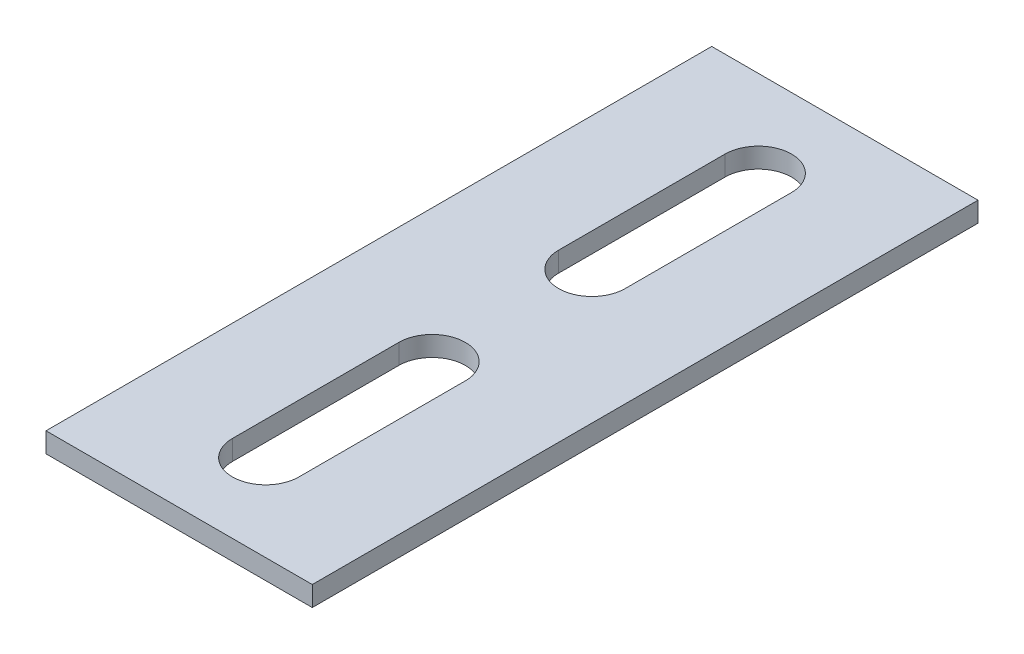
ISO-10303-21;
HEADER;
FILE_DESCRIPTION(('STEP AP214'),'2;1');
FILE_NAME('part.step','',(''),(''),'','','');
FILE_SCHEMA(('AUTOMOTIVE_DESIGN { 1 0 10303 214 1 1 1 1 }'));
ENDSEC;
DATA;
#1=APPLICATION_CONTEXT('core data for automotive mechanical design processes');
#2=APPLICATION_PROTOCOL_DEFINITION('international standard','automotive_design',2000,#1);
#3=PRODUCT_CONTEXT('',#1,'mechanical');
#4=PRODUCT('Part','Part','',(#3));
#5=PRODUCT_RELATED_PRODUCT_CATEGORY('part','',(#4));
#6=PRODUCT_DEFINITION_FORMATION('','',#4);
#7=PRODUCT_DEFINITION_CONTEXT('part definition',#1,'design');
#8=PRODUCT_DEFINITION('design','',#6,#7);
#9=PRODUCT_DEFINITION_SHAPE('','',#8);
#10=(LENGTH_UNIT() NAMED_UNIT(*) SI_UNIT(.MILLI.,.METRE.));
#11=(NAMED_UNIT(*) PLANE_ANGLE_UNIT() SI_UNIT($,.RADIAN.));
#12=(NAMED_UNIT(*) SI_UNIT($,.STERADIAN.) SOLID_ANGLE_UNIT());
#13=UNCERTAINTY_MEASURE_WITH_UNIT(LENGTH_MEASURE(1.E-05),#10,'distance_accuracy_value','');
#14=(GEOMETRIC_REPRESENTATION_CONTEXT(3) GLOBAL_UNCERTAINTY_ASSIGNED_CONTEXT((#13)) GLOBAL_UNIT_ASSIGNED_CONTEXT((#10,
#11,#12)) REPRESENTATION_CONTEXT('',''));
#15=CARTESIAN_POINT('',(0.,0.,0.));
#16=DIRECTION('',(0.,0.,1.));
#17=DIRECTION('',(1.,0.,0.));
#18=AXIS2_PLACEMENT_3D('',#15,#16,#17);
#19=CARTESIAN_POINT('',(0.,1.5,0.));
#20=DIRECTION('',(0.,-1.,0.));
#21=DIRECTION('',(0.,0.,-1.));
#22=AXIS2_PLACEMENT_3D('',#19,#20,#21);
#23=PLANE('',#22);
#24=CARTESIAN_POINT('',(0.,1.5,-12.));
#25=DIRECTION('',(0.,1.,0.));
#26=DIRECTION('',(0.,0.,1.));
#27=AXIS2_PLACEMENT_3D('',#24,#25,#26);
#28=CIRCLE('',#27,5.);
#29=CARTESIAN_POINT('',(-4.99999999999999,1.5,-12.));
#30=VERTEX_POINT('',#29);
#31=CARTESIAN_POINT('',(5.00000000000001,1.5,-12.));
#32=VERTEX_POINT('',#31);
#33=EDGE_CURVE('E162',#30,#32,#28,.T.);
#34=ORIENTED_EDGE('',*,*,#33,.F.);
#35=DIRECTION('',(0.,0.,1.));
#36=VECTOR('',#35,1.);
#37=CARTESIAN_POINT('',(-4.99999999999999,1.5,-12.));
#38=LINE('',#37,#36);
#39=CARTESIAN_POINT('',(-5.,1.5,-37.));
#40=VERTEX_POINT('',#39);
#41=EDGE_CURVE('E170',#40,#30,#38,.T.);
#42=ORIENTED_EDGE('',*,*,#41,.F.);
#43=CARTESIAN_POINT('',(0.,1.5,-37.));
#44=DIRECTION('',(0.,1.,0.));
#45=DIRECTION('',(0.,0.,1.));
#46=AXIS2_PLACEMENT_3D('',#43,#44,#45);
#47=CIRCLE('',#46,5.);
#48=CARTESIAN_POINT('',(5.,1.5,-37.));
#49=VERTEX_POINT('',#48);
#50=EDGE_CURVE('E167',#49,#40,#47,.T.);
#51=ORIENTED_EDGE('',*,*,#50,.F.);
#52=DIRECTION('',(0.,0.,-1.));
#53=VECTOR('',#52,1.);
#54=CARTESIAN_POINT('',(5.00000000000001,1.5,-12.));
#55=LINE('',#54,#53);
#56=EDGE_CURVE('E164',#32,#49,#55,.T.);
#57=ORIENTED_EDGE('',*,*,#56,.F.);
#58=EDGE_LOOP('',(#34,#42,#51,#57));
#59=FACE_BOUND('',#58,.T.);
#60=DIRECTION('',(0.,0.,-1.));
#61=VECTOR('',#60,1.);
#62=CARTESIAN_POINT('',(20.,1.5,50.));
#63=LINE('',#62,#61);
#64=CARTESIAN_POINT('',(20.,1.5,50.));
#65=VERTEX_POINT('',#64);
#66=CARTESIAN_POINT('',(20.,1.5,-50.));
#67=VERTEX_POINT('',#66);
#68=EDGE_CURVE('E193',#65,#67,#63,.T.);
#69=ORIENTED_EDGE('',*,*,#68,.T.);
#70=DIRECTION('',(-1.,0.,0.));
#71=VECTOR('',#70,1.);
#72=CARTESIAN_POINT('',(-20.,1.5,-50.));
#73=LINE('',#72,#71);
#74=CARTESIAN_POINT('',(-20.,1.5,-50.));
#75=VERTEX_POINT('',#74);
#76=EDGE_CURVE('E196',#67,#75,#73,.T.);
#77=ORIENTED_EDGE('',*,*,#76,.T.);
#78=DIRECTION('',(0.,0.,1.));
#79=VECTOR('',#78,1.);
#80=CARTESIAN_POINT('',(-20.,1.5,50.));
#81=LINE('',#80,#79);
#82=CARTESIAN_POINT('',(-20.,1.5,50.));
#83=VERTEX_POINT('',#82);
#84=EDGE_CURVE('E199',#75,#83,#81,.T.);
#85=ORIENTED_EDGE('',*,*,#84,.T.);
#86=DIRECTION('',(1.,0.,0.));
#87=VECTOR('',#86,1.);
#88=CARTESIAN_POINT('',(-20.,1.5,50.));
#89=LINE('',#88,#87);
#90=EDGE_CURVE('E201',#83,#65,#89,.T.);
#91=ORIENTED_EDGE('',*,*,#90,.T.);
#92=EDGE_LOOP('',(#69,#77,#85,#91));
#93=FACE_BOUND('',#92,.T.);
#94=CARTESIAN_POINT('',(0.,1.5,37.));
#95=DIRECTION('',(0.,1.,0.));
#96=DIRECTION('',(0.,0.,1.));
#97=AXIS2_PLACEMENT_3D('',#94,#95,#96);
#98=CIRCLE('',#97,4.99999999999999);
#99=CARTESIAN_POINT('',(-4.99999999999998,1.5,37.));
#100=VERTEX_POINT('',#99);
#101=CARTESIAN_POINT('',(5.00000000000001,1.5,37.));
#102=VERTEX_POINT('',#101);
#103=EDGE_CURVE('E126',#100,#102,#98,.T.);
#104=ORIENTED_EDGE('',*,*,#103,.F.);
#105=DIRECTION('',(0.,0.,1.));
#106=VECTOR('',#105,1.);
#107=CARTESIAN_POINT('',(-4.99999999999998,1.5,37.));
#108=LINE('',#107,#106);
#109=CARTESIAN_POINT('',(-4.99999999999999,1.5,12.));
#110=VERTEX_POINT('',#109);
#111=EDGE_CURVE('E148',#110,#100,#108,.T.);
#112=ORIENTED_EDGE('',*,*,#111,.F.);
#113=CARTESIAN_POINT('',(0.,1.5,12.));
#114=DIRECTION('',(0.,1.,0.));
#115=DIRECTION('',(0.,0.,1.));
#116=AXIS2_PLACEMENT_3D('',#113,#114,#115);
#117=CIRCLE('',#116,4.99999999999999);
#118=CARTESIAN_POINT('',(5.,1.5,12.));
#119=VERTEX_POINT('',#118);
#120=EDGE_CURVE('E146',#119,#110,#117,.T.);
#121=ORIENTED_EDGE('',*,*,#120,.F.);
#122=DIRECTION('',(0.,0.,-1.));
#123=VECTOR('',#122,1.);
#124=CARTESIAN_POINT('',(5.00000000000001,1.5,37.));
#125=LINE('',#124,#123);
#126=EDGE_CURVE('E134',#102,#119,#125,.T.);
#127=ORIENTED_EDGE('',*,*,#126,.F.);
#128=EDGE_LOOP('',(#104,#112,#121,#127));
#129=FACE_BOUND('',#128,.T.);
#130=ADVANCED_FACE('F37',(#59,#93,#129),#23,.F.);
#131=CARTESIAN_POINT('',(0.,-1.5,0.));
#132=DIRECTION('',(0.,-1.,0.));
#133=DIRECTION('',(0.,0.,-1.));
#134=AXIS2_PLACEMENT_3D('',#131,#132,#133);
#135=PLANE('',#134);
#136=DIRECTION('',(0.,0.,-1.));
#137=VECTOR('',#136,1.);
#138=CARTESIAN_POINT('',(20.,-1.5,50.));
#139=LINE('',#138,#137);
#140=CARTESIAN_POINT('',(20.,-1.5,50.));
#141=VERTEX_POINT('',#140);
#142=CARTESIAN_POINT('',(20.,-1.5,-50.));
#143=VERTEX_POINT('',#142);
#144=EDGE_CURVE('E192',#141,#143,#139,.T.);
#145=ORIENTED_EDGE('',*,*,#144,.F.);
#146=DIRECTION('',(1.,0.,0.));
#147=VECTOR('',#146,1.);
#148=CARTESIAN_POINT('',(-20.,-1.5,50.));
#149=LINE('',#148,#147);
#150=CARTESIAN_POINT('',(-20.,-1.5,50.));
#151=VERTEX_POINT('',#150);
#152=EDGE_CURVE('E197',#151,#141,#149,.T.);
#153=ORIENTED_EDGE('',*,*,#152,.F.);
#154=DIRECTION('',(0.,0.,1.));
#155=VECTOR('',#154,1.);
#156=CARTESIAN_POINT('',(-20.,-1.5,50.));
#157=LINE('',#156,#155);
#158=CARTESIAN_POINT('',(-20.,-1.5,-50.));
#159=VERTEX_POINT('',#158);
#160=EDGE_CURVE('E208',#159,#151,#157,.T.);
#161=ORIENTED_EDGE('',*,*,#160,.F.);
#162=DIRECTION('',(-1.,0.,0.));
#163=VECTOR('',#162,1.);
#164=CARTESIAN_POINT('',(-20.,-1.5,-50.));
#165=LINE('',#164,#163);
#166=EDGE_CURVE('E206',#143,#159,#165,.T.);
#167=ORIENTED_EDGE('',*,*,#166,.F.);
#168=EDGE_LOOP('',(#145,#153,#161,#167));
#169=FACE_BOUND('',#168,.T.);
#170=DIRECTION('',(0.,0.,1.));
#171=VECTOR('',#170,1.);
#172=CARTESIAN_POINT('',(-4.99999999999999,-1.5,-12.));
#173=LINE('',#172,#171);
#174=CARTESIAN_POINT('',(-5.,-1.5,-37.));
#175=VERTEX_POINT('',#174);
#176=CARTESIAN_POINT('',(-4.99999999999999,-1.5,-12.));
#177=VERTEX_POINT('',#176);
#178=EDGE_CURVE('E165',#175,#177,#173,.T.);
#179=ORIENTED_EDGE('',*,*,#178,.T.);
#180=CARTESIAN_POINT('',(0.,-1.5,-12.));
#181=DIRECTION('',(0.,1.,0.));
#182=DIRECTION('',(0.,0.,1.));
#183=AXIS2_PLACEMENT_3D('',#180,#181,#182);
#184=CIRCLE('',#183,5.);
#185=CARTESIAN_POINT('',(5.00000000000001,-1.5,-12.));
#186=VERTEX_POINT('',#185);
#187=EDGE_CURVE('E142',#177,#186,#184,.T.);
#188=ORIENTED_EDGE('',*,*,#187,.T.);
#189=DIRECTION('',(0.,0.,-1.));
#190=VECTOR('',#189,1.);
#191=CARTESIAN_POINT('',(5.00000000000001,-1.5,-12.));
#192=LINE('',#191,#190);
#193=CARTESIAN_POINT('',(5.,-1.5,-37.));
#194=VERTEX_POINT('',#193);
#195=EDGE_CURVE('E175',#186,#194,#192,.T.);
#196=ORIENTED_EDGE('',*,*,#195,.T.);
#197=CARTESIAN_POINT('',(0.,-1.5,-37.));
#198=DIRECTION('',(0.,1.,0.));
#199=DIRECTION('',(0.,0.,1.));
#200=AXIS2_PLACEMENT_3D('',#197,#198,#199);
#201=CIRCLE('',#200,5.);
#202=EDGE_CURVE('E178',#194,#175,#201,.T.);
#203=ORIENTED_EDGE('',*,*,#202,.T.);
#204=EDGE_LOOP('',(#179,#188,#196,#203));
#205=FACE_BOUND('',#204,.T.);
#206=DIRECTION('',(0.,0.,1.));
#207=VECTOR('',#206,1.);
#208=CARTESIAN_POINT('',(-4.99999999999998,-1.5,37.));
#209=LINE('',#208,#207);
#210=CARTESIAN_POINT('',(-4.99999999999999,-1.5,12.));
#211=VERTEX_POINT('',#210);
#212=CARTESIAN_POINT('',(-4.99999999999998,-1.5,37.));
#213=VERTEX_POINT('',#212);
#214=EDGE_CURVE('E135',#211,#213,#209,.T.);
#215=ORIENTED_EDGE('',*,*,#214,.T.);
#216=CARTESIAN_POINT('',(0.,-1.5,37.));
#217=DIRECTION('',(0.,1.,0.));
#218=DIRECTION('',(0.,0.,1.));
#219=AXIS2_PLACEMENT_3D('',#216,#217,#218);
#220=CIRCLE('',#219,4.99999999999999);
#221=CARTESIAN_POINT('',(5.00000000000001,-1.5,37.));
#222=VERTEX_POINT('',#221);
#223=EDGE_CURVE('E60',#213,#222,#220,.T.);
#224=ORIENTED_EDGE('',*,*,#223,.T.);
#225=DIRECTION('',(0.,0.,-1.));
#226=VECTOR('',#225,1.);
#227=CARTESIAN_POINT('',(5.00000000000001,-1.5,37.));
#228=LINE('',#227,#226);
#229=CARTESIAN_POINT('',(5.,-1.5,12.));
#230=VERTEX_POINT('',#229);
#231=EDGE_CURVE('E141',#222,#230,#228,.T.);
#232=ORIENTED_EDGE('',*,*,#231,.T.);
#233=CARTESIAN_POINT('',(0.,-1.5,12.));
#234=DIRECTION('',(0.,1.,0.));
#235=DIRECTION('',(0.,0.,1.));
#236=AXIS2_PLACEMENT_3D('',#233,#234,#235);
#237=CIRCLE('',#236,4.99999999999999);
#238=EDGE_CURVE('E154',#230,#211,#237,.T.);
#239=ORIENTED_EDGE('',*,*,#238,.T.);
#240=EDGE_LOOP('',(#215,#224,#232,#239));
#241=FACE_BOUND('',#240,.T.);
#242=ADVANCED_FACE('F226',(#169,#205,#241),#135,.T.);
#243=CARTESIAN_POINT('',(20.,1.5,50.));
#244=DIRECTION('',(-1.,0.,0.));
#245=DIRECTION('',(0.,0.,1.));
#246=AXIS2_PLACEMENT_3D('',#243,#244,#245);
#247=PLANE('',#246);
#248=ORIENTED_EDGE('',*,*,#144,.T.);
#249=DIRECTION('',(0.,-1.,0.));
#250=VECTOR('',#249,1.);
#251=CARTESIAN_POINT('',(20.,1.5,-50.));
#252=LINE('',#251,#250);
#253=EDGE_CURVE('E11',#67,#143,#252,.T.);
#254=ORIENTED_EDGE('',*,*,#253,.F.);
#255=ORIENTED_EDGE('',*,*,#68,.F.);
#256=DIRECTION('',(0.,-1.,0.));
#257=VECTOR('',#256,1.);
#258=CARTESIAN_POINT('',(20.,1.5,50.));
#259=LINE('',#258,#257);
#260=EDGE_CURVE('E203',#65,#141,#259,.T.);
#261=ORIENTED_EDGE('',*,*,#260,.T.);
#262=EDGE_LOOP('',(#248,#254,#255,#261));
#263=FACE_BOUND('',#262,.T.);
#264=ADVANCED_FACE('F39',(#263),#247,.F.);
#265=CARTESIAN_POINT('',(-20.,1.5,-50.));
#266=DIRECTION('',(0.,0.,1.));
#267=DIRECTION('',(1.,0.,0.));
#268=AXIS2_PLACEMENT_3D('',#265,#266,#267);
#269=PLANE('',#268);
#270=ORIENTED_EDGE('',*,*,#166,.T.);
#271=DIRECTION('',(0.,-1.,0.));
#272=VECTOR('',#271,1.);
#273=CARTESIAN_POINT('',(-20.,1.5,-50.));
#274=LINE('',#273,#272);
#275=EDGE_CURVE('E45',#75,#159,#274,.T.);
#276=ORIENTED_EDGE('',*,*,#275,.F.);
#277=ORIENTED_EDGE('',*,*,#76,.F.);
#278=ORIENTED_EDGE('',*,*,#253,.T.);
#279=EDGE_LOOP('',(#270,#276,#277,#278));
#280=FACE_BOUND('',#279,.T.);
#281=ADVANCED_FACE('F236',(#280),#269,.F.);
#282=CARTESIAN_POINT('',(-20.,1.5,50.));
#283=DIRECTION('',(1.,0.,0.));
#284=DIRECTION('',(0.,0.,-1.));
#285=AXIS2_PLACEMENT_3D('',#282,#283,#284);
#286=PLANE('',#285);
#287=ORIENTED_EDGE('',*,*,#160,.T.);
#288=DIRECTION('',(0.,-1.,0.));
#289=VECTOR('',#288,1.);
#290=CARTESIAN_POINT('',(-20.,1.5,50.));
#291=LINE('',#290,#289);
#292=EDGE_CURVE('E213',#83,#151,#291,.T.);
#293=ORIENTED_EDGE('',*,*,#292,.F.);
#294=ORIENTED_EDGE('',*,*,#84,.F.);
#295=ORIENTED_EDGE('',*,*,#275,.T.);
#296=EDGE_LOOP('',(#287,#293,#294,#295));
#297=FACE_BOUND('',#296,.T.);
#298=ADVANCED_FACE('F220',(#297),#286,.F.);
#299=CARTESIAN_POINT('',(-20.,1.5,50.));
#300=DIRECTION('',(0.,0.,-1.));
#301=DIRECTION('',(-1.,0.,0.));
#302=AXIS2_PLACEMENT_3D('',#299,#300,#301);
#303=PLANE('',#302);
#304=ORIENTED_EDGE('',*,*,#152,.T.);
#305=ORIENTED_EDGE('',*,*,#260,.F.);
#306=ORIENTED_EDGE('',*,*,#90,.F.);
#307=ORIENTED_EDGE('',*,*,#292,.T.);
#308=EDGE_LOOP('',(#304,#305,#306,#307));
#309=FACE_BOUND('',#308,.T.);
#310=ADVANCED_FACE('F230',(#309),#303,.F.);
#311=CARTESIAN_POINT('',(0.,1.5,-12.));
#312=DIRECTION('',(0.,-1.,0.));
#313=DIRECTION('',(0.,0.,-1.));
#314=AXIS2_PLACEMENT_3D('',#311,#312,#313);
#315=CYLINDRICAL_SURFACE('',#314,5.);
#316=ORIENTED_EDGE('',*,*,#187,.F.);
#317=DIRECTION('',(0.,-1.,0.));
#318=VECTOR('',#317,1.);
#319=CARTESIAN_POINT('',(-4.99999999999999,1.5,-12.));
#320=LINE('',#319,#318);
#321=EDGE_CURVE('E172',#30,#177,#320,.T.);
#322=ORIENTED_EDGE('',*,*,#321,.F.);
#323=ORIENTED_EDGE('',*,*,#33,.T.);
#324=DIRECTION('',(0.,-1.,0.));
#325=VECTOR('',#324,1.);
#326=CARTESIAN_POINT('',(5.00000000000001,1.5,-12.));
#327=LINE('',#326,#325);
#328=EDGE_CURVE('E189',#32,#186,#327,.T.);
#329=ORIENTED_EDGE('',*,*,#328,.T.);
#330=EDGE_LOOP('',(#316,#322,#323,#329));
#331=FACE_BOUND('',#330,.T.);
#332=ADVANCED_FACE('F252',(#331),#315,.F.);
#333=CARTESIAN_POINT('',(5.00000000000001,1.5,-12.));
#334=DIRECTION('',(-1.,0.,0.));
#335=DIRECTION('',(0.,0.,1.));
#336=AXIS2_PLACEMENT_3D('',#333,#334,#335);
#337=PLANE('',#336);
#338=ORIENTED_EDGE('',*,*,#195,.F.);
#339=ORIENTED_EDGE('',*,*,#328,.F.);
#340=ORIENTED_EDGE('',*,*,#56,.T.);
#341=DIRECTION('',(0.,-1.,0.));
#342=VECTOR('',#341,1.);
#343=CARTESIAN_POINT('',(5.,1.5,-37.));
#344=LINE('',#343,#342);
#345=EDGE_CURVE('E187',#49,#194,#344,.T.);
#346=ORIENTED_EDGE('',*,*,#345,.T.);
#347=EDGE_LOOP('',(#338,#339,#340,#346));
#348=FACE_BOUND('',#347,.T.);
#349=ADVANCED_FACE('F259',(#348),#337,.T.);
#350=CARTESIAN_POINT('',(0.,1.5,-37.));
#351=DIRECTION('',(0.,-1.,0.));
#352=DIRECTION('',(0.,0.,-1.));
#353=AXIS2_PLACEMENT_3D('',#350,#351,#352);
#354=CYLINDRICAL_SURFACE('',#353,5.);
#355=ORIENTED_EDGE('',*,*,#202,.F.);
#356=ORIENTED_EDGE('',*,*,#345,.F.);
#357=ORIENTED_EDGE('',*,*,#50,.T.);
#358=DIRECTION('',(0.,-1.,0.));
#359=VECTOR('',#358,1.);
#360=CARTESIAN_POINT('',(-5.,1.5,-37.));
#361=LINE('',#360,#359);
#362=EDGE_CURVE('E185',#40,#175,#361,.T.);
#363=ORIENTED_EDGE('',*,*,#362,.T.);
#364=EDGE_LOOP('',(#355,#356,#357,#363));
#365=FACE_BOUND('',#364,.T.);
#366=ADVANCED_FACE('F264',(#365),#354,.F.);
#367=CARTESIAN_POINT('',(-4.99999999999999,1.5,-12.));
#368=DIRECTION('',(1.,0.,0.));
#369=DIRECTION('',(0.,0.,-1.));
#370=AXIS2_PLACEMENT_3D('',#367,#368,#369);
#371=PLANE('',#370);
#372=ORIENTED_EDGE('',*,*,#178,.F.);
#373=ORIENTED_EDGE('',*,*,#362,.F.);
#374=ORIENTED_EDGE('',*,*,#41,.T.);
#375=ORIENTED_EDGE('',*,*,#321,.T.);
#376=EDGE_LOOP('',(#372,#373,#374,#375));
#377=FACE_BOUND('',#376,.T.);
#378=ADVANCED_FACE('F270',(#377),#371,.T.);
#379=CARTESIAN_POINT('',(0.,1.5,37.));
#380=DIRECTION('',(0.,-1.,0.));
#381=DIRECTION('',(0.,0.,-1.));
#382=AXIS2_PLACEMENT_3D('',#379,#380,#381);
#383=CYLINDRICAL_SURFACE('',#382,4.99999999999999);
#384=ORIENTED_EDGE('',*,*,#223,.F.);
#385=DIRECTION('',(0.,-1.,0.));
#386=VECTOR('',#385,1.);
#387=CARTESIAN_POINT('',(-4.99999999999998,1.5,37.));
#388=LINE('',#387,#386);
#389=EDGE_CURVE('E130',#100,#213,#388,.T.);
#390=ORIENTED_EDGE('',*,*,#389,.F.);
#391=ORIENTED_EDGE('',*,*,#103,.T.);
#392=DIRECTION('',(0.,-1.,0.));
#393=VECTOR('',#392,1.);
#394=CARTESIAN_POINT('',(5.00000000000001,1.5,37.));
#395=LINE('',#394,#393);
#396=EDGE_CURVE('E129',#102,#222,#395,.T.);
#397=ORIENTED_EDGE('',*,*,#396,.T.);
#398=EDGE_LOOP('',(#384,#390,#391,#397));
#399=FACE_BOUND('',#398,.T.);
#400=ADVANCED_FACE('F128',(#399),#383,.F.);
#401=CARTESIAN_POINT('',(5.00000000000001,1.5,37.));
#402=DIRECTION('',(-1.,0.,0.));
#403=DIRECTION('',(0.,0.,1.));
#404=AXIS2_PLACEMENT_3D('',#401,#402,#403);
#405=PLANE('',#404);
#406=ORIENTED_EDGE('',*,*,#231,.F.);
#407=ORIENTED_EDGE('',*,*,#396,.F.);
#408=ORIENTED_EDGE('',*,*,#126,.T.);
#409=DIRECTION('',(0.,-1.,0.));
#410=VECTOR('',#409,1.);
#411=CARTESIAN_POINT('',(5.,1.5,12.));
#412=LINE('',#411,#410);
#413=EDGE_CURVE('E143',#119,#230,#412,.T.);
#414=ORIENTED_EDGE('',*,*,#413,.T.);
#415=EDGE_LOOP('',(#406,#407,#408,#414));
#416=FACE_BOUND('',#415,.T.);
#417=ADVANCED_FACE('F138',(#416),#405,.T.);
#418=CARTESIAN_POINT('',(0.,1.5,12.));
#419=DIRECTION('',(0.,-1.,0.));
#420=DIRECTION('',(0.,0.,-1.));
#421=AXIS2_PLACEMENT_3D('',#418,#419,#420);
#422=CYLINDRICAL_SURFACE('',#421,4.99999999999999);
#423=ORIENTED_EDGE('',*,*,#238,.F.);
#424=ORIENTED_EDGE('',*,*,#413,.F.);
#425=ORIENTED_EDGE('',*,*,#120,.T.);
#426=DIRECTION('',(0.,-1.,0.));
#427=VECTOR('',#426,1.);
#428=CARTESIAN_POINT('',(-4.99999999999999,1.5,12.));
#429=LINE('',#428,#427);
#430=EDGE_CURVE('E52',#110,#211,#429,.T.);
#431=ORIENTED_EDGE('',*,*,#430,.T.);
#432=EDGE_LOOP('',(#423,#424,#425,#431));
#433=FACE_BOUND('',#432,.T.);
#434=ADVANCED_FACE('F289',(#433),#422,.F.);
#435=CARTESIAN_POINT('',(-4.99999999999998,1.5,37.));
#436=DIRECTION('',(1.,0.,0.));
#437=DIRECTION('',(0.,0.,-1.));
#438=AXIS2_PLACEMENT_3D('',#435,#436,#437);
#439=PLANE('',#438);
#440=ORIENTED_EDGE('',*,*,#214,.F.);
#441=ORIENTED_EDGE('',*,*,#430,.F.);
#442=ORIENTED_EDGE('',*,*,#111,.T.);
#443=ORIENTED_EDGE('',*,*,#389,.T.);
#444=EDGE_LOOP('',(#440,#441,#442,#443));
#445=FACE_BOUND('',#444,.T.);
#446=ADVANCED_FACE('F292',(#445),#439,.T.);
#447=CLOSED_SHELL('',(#130,#242,#264,#281,#298,#310,#332,#349,#366,#378,#400,#417,#434,#446));
#448=MANIFOLD_SOLID_BREP('B2',#447);
#449=ADVANCED_BREP_SHAPE_REPRESENTATION('',(#18,#448),#14);
#450=SHAPE_DEFINITION_REPRESENTATION(#9,#449);
ENDSEC;
END-ISO-10303-21;
